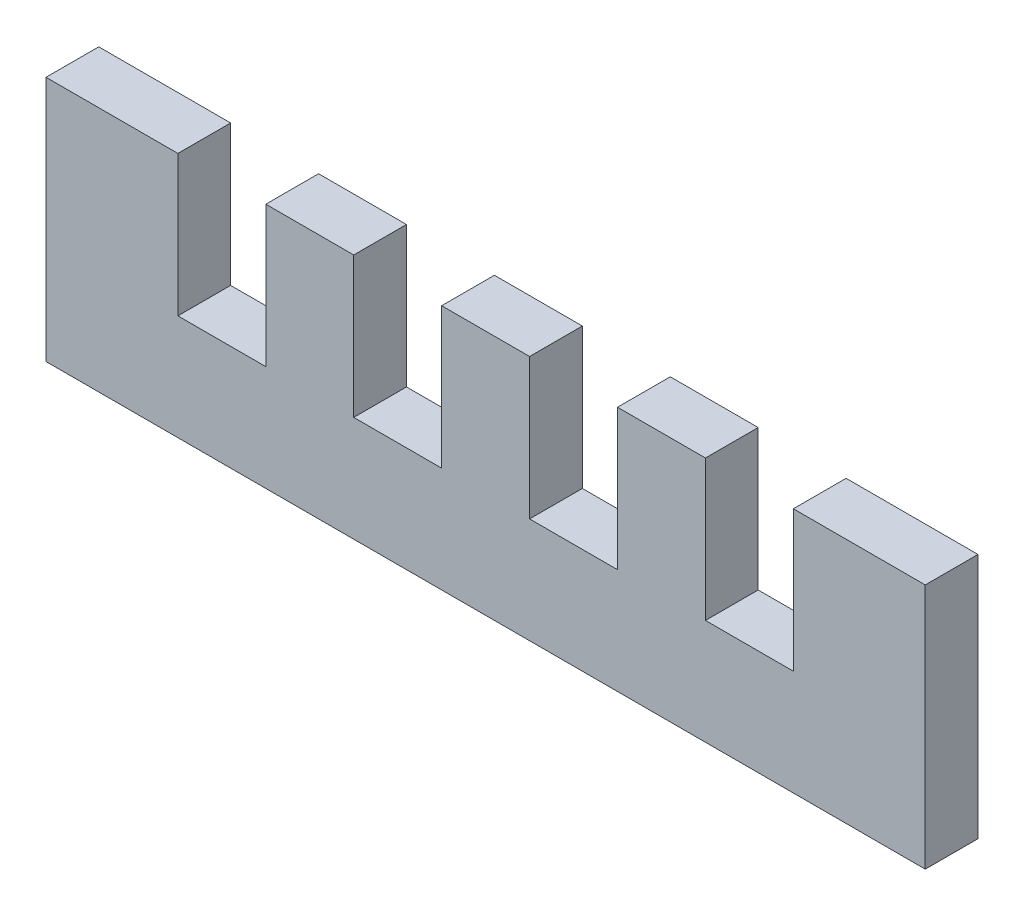
ISO-10303-21;
HEADER;
FILE_DESCRIPTION(('STEP AP214'),'2;1');
FILE_NAME('part.step','',(''),(''),'','','');
FILE_SCHEMA(('AUTOMOTIVE_DESIGN { 1 0 10303 214 1 1 1 1 }'));
ENDSEC;
DATA;
#1=APPLICATION_CONTEXT('core data for automotive mechanical design processes');
#2=APPLICATION_PROTOCOL_DEFINITION('international standard','automotive_design',2000,#1);
#3=PRODUCT_CONTEXT('',#1,'mechanical');
#4=PRODUCT('Part','Part','',(#3));
#5=PRODUCT_RELATED_PRODUCT_CATEGORY('part','',(#4));
#6=PRODUCT_DEFINITION_FORMATION('','',#4);
#7=PRODUCT_DEFINITION_CONTEXT('part definition',#1,'design');
#8=PRODUCT_DEFINITION('design','',#6,#7);
#9=PRODUCT_DEFINITION_SHAPE('','',#8);
#10=(LENGTH_UNIT() NAMED_UNIT(*) SI_UNIT(.MILLI.,.METRE.));
#11=(NAMED_UNIT(*) PLANE_ANGLE_UNIT() SI_UNIT($,.RADIAN.));
#12=(NAMED_UNIT(*) SI_UNIT($,.STERADIAN.) SOLID_ANGLE_UNIT());
#13=UNCERTAINTY_MEASURE_WITH_UNIT(LENGTH_MEASURE(1.E-05),#10,'distance_accuracy_value','');
#14=(GEOMETRIC_REPRESENTATION_CONTEXT(3) GLOBAL_UNCERTAINTY_ASSIGNED_CONTEXT((#13)) GLOBAL_UNIT_ASSIGNED_CONTEXT((#10,
#11,#12)) REPRESENTATION_CONTEXT('',''));
#15=CARTESIAN_POINT('',(0.,0.,0.));
#16=DIRECTION('',(0.,0.,1.));
#17=DIRECTION('',(1.,0.,0.));
#18=AXIS2_PLACEMENT_3D('',#15,#16,#17);
#19=CARTESIAN_POINT('',(0.,14.,3.));
#20=DIRECTION('',(0.,1.,0.));
#21=DIRECTION('',(0.,0.,1.));
#22=AXIS2_PLACEMENT_3D('',#19,#20,#21);
#23=PLANE('',#22);
#24=DIRECTION('',(1.,0.,0.));
#25=VECTOR('',#24,1.);
#26=CARTESIAN_POINT('',(0.,14.,0.));
#27=LINE('',#26,#25);
#28=CARTESIAN_POINT('',(17.5,14.,0.));
#29=VERTEX_POINT('',#28);
#30=CARTESIAN_POINT('',(25.,14.,0.));
#31=VERTEX_POINT('',#30);
#32=EDGE_CURVE('E207',#29,#31,#27,.T.);
#33=ORIENTED_EDGE('',*,*,#32,.F.);
#34=DIRECTION('',(0.,0.,-1.));
#35=VECTOR('',#34,1.);
#36=CARTESIAN_POINT('',(17.5,14.,3.));
#37=LINE('',#36,#35);
#38=CARTESIAN_POINT('',(17.5,14.,3.));
#39=VERTEX_POINT('',#38);
#40=EDGE_CURVE('E11',#39,#29,#37,.T.);
#41=ORIENTED_EDGE('',*,*,#40,.F.);
#42=DIRECTION('',(1.,0.,0.));
#43=VECTOR('',#42,1.);
#44=CARTESIAN_POINT('',(0.,14.,3.));
#45=LINE('',#44,#43);
#46=CARTESIAN_POINT('',(25.,14.,3.));
#47=VERTEX_POINT('',#46);
#48=EDGE_CURVE('E262',#39,#47,#45,.T.);
#49=ORIENTED_EDGE('',*,*,#48,.T.);
#50=DIRECTION('',(0.,0.,-1.));
#51=VECTOR('',#50,1.);
#52=CARTESIAN_POINT('',(25.,14.,3.));
#53=LINE('',#52,#51);
#54=EDGE_CURVE('E127',#47,#31,#53,.T.);
#55=ORIENTED_EDGE('',*,*,#54,.T.);
#56=EDGE_LOOP('',(#33,#41,#49,#55));
#57=FACE_BOUND('',#56,.T.);
#58=ADVANCED_FACE('F41',(#57),#23,.T.);
#59=CARTESIAN_POINT('',(17.5,0.,3.));
#60=DIRECTION('',(-1.,0.,0.));
#61=DIRECTION('',(0.,0.,1.));
#62=AXIS2_PLACEMENT_3D('',#59,#60,#61);
#63=PLANE('',#62);
#64=DIRECTION('',(0.,1.,0.));
#65=VECTOR('',#64,1.);
#66=CARTESIAN_POINT('',(17.5,0.,0.));
#67=LINE('',#66,#65);
#68=CARTESIAN_POINT('',(17.5,6.00000000000001,0.));
#69=VERTEX_POINT('',#68);
#70=EDGE_CURVE('E210',#69,#29,#67,.T.);
#71=ORIENTED_EDGE('',*,*,#70,.F.);
#72=DIRECTION('',(0.,0.,-1.));
#73=VECTOR('',#72,1.);
#74=CARTESIAN_POINT('',(17.5,6.00000000000001,3.));
#75=LINE('',#74,#73);
#76=CARTESIAN_POINT('',(17.5,6.00000000000001,3.));
#77=VERTEX_POINT('',#76);
#78=EDGE_CURVE('E49',#77,#69,#75,.T.);
#79=ORIENTED_EDGE('',*,*,#78,.F.);
#80=DIRECTION('',(0.,1.,0.));
#81=VECTOR('',#80,1.);
#82=CARTESIAN_POINT('',(17.5,0.,3.));
#83=LINE('',#82,#81);
#84=EDGE_CURVE('E315',#77,#39,#83,.T.);
#85=ORIENTED_EDGE('',*,*,#84,.T.);
#86=ORIENTED_EDGE('',*,*,#40,.T.);
#87=EDGE_LOOP('',(#71,#79,#85,#86));
#88=FACE_BOUND('',#87,.T.);
#89=ADVANCED_FACE('F303',(#88),#63,.T.);
#90=CARTESIAN_POINT('',(0.,6.00000000000001,3.));
#91=DIRECTION('',(0.,1.,0.));
#92=DIRECTION('',(0.,0.,1.));
#93=AXIS2_PLACEMENT_3D('',#90,#91,#92);
#94=PLANE('',#93);
#95=DIRECTION('',(1.,0.,0.));
#96=VECTOR('',#95,1.);
#97=CARTESIAN_POINT('',(0.,6.00000000000001,0.));
#98=LINE('',#97,#96);
#99=CARTESIAN_POINT('',(12.5,6.00000000000001,0.));
#100=VERTEX_POINT('',#99);
#101=EDGE_CURVE('E213',#100,#69,#98,.T.);
#102=ORIENTED_EDGE('',*,*,#101,.F.);
#103=DIRECTION('',(0.,0.,-1.));
#104=VECTOR('',#103,1.);
#105=CARTESIAN_POINT('',(12.5,6.00000000000001,3.));
#106=LINE('',#105,#104);
#107=CARTESIAN_POINT('',(12.5,6.00000000000001,3.));
#108=VERTEX_POINT('',#107);
#109=EDGE_CURVE('E292',#108,#100,#106,.T.);
#110=ORIENTED_EDGE('',*,*,#109,.F.);
#111=DIRECTION('',(1.,0.,0.));
#112=VECTOR('',#111,1.);
#113=CARTESIAN_POINT('',(0.,6.00000000000001,3.));
#114=LINE('',#113,#112);
#115=EDGE_CURVE('E299',#108,#77,#114,.T.);
#116=ORIENTED_EDGE('',*,*,#115,.T.);
#117=ORIENTED_EDGE('',*,*,#78,.T.);
#118=EDGE_LOOP('',(#102,#110,#116,#117));
#119=FACE_BOUND('',#118,.T.);
#120=ADVANCED_FACE('F297',(#119),#94,.T.);
#121=CARTESIAN_POINT('',(12.5,0.,3.));
#122=DIRECTION('',(1.,0.,0.));
#123=DIRECTION('',(0.,0.,-1.));
#124=AXIS2_PLACEMENT_3D('',#121,#122,#123);
#125=PLANE('',#124);
#126=DIRECTION('',(0.,-1.,0.));
#127=VECTOR('',#126,1.);
#128=CARTESIAN_POINT('',(12.5,0.,0.));
#129=LINE('',#128,#127);
#130=CARTESIAN_POINT('',(12.5,14.,0.));
#131=VERTEX_POINT('',#130);
#132=EDGE_CURVE('E216',#131,#100,#129,.T.);
#133=ORIENTED_EDGE('',*,*,#132,.F.);
#134=DIRECTION('',(0.,0.,-1.));
#135=VECTOR('',#134,1.);
#136=CARTESIAN_POINT('',(12.5,14.,3.));
#137=LINE('',#136,#135);
#138=CARTESIAN_POINT('',(12.5,14.,3.));
#139=VERTEX_POINT('',#138);
#140=EDGE_CURVE('E290',#139,#131,#137,.T.);
#141=ORIENTED_EDGE('',*,*,#140,.F.);
#142=DIRECTION('',(0.,-1.,0.));
#143=VECTOR('',#142,1.);
#144=CARTESIAN_POINT('',(12.5,0.,3.));
#145=LINE('',#144,#143);
#146=EDGE_CURVE('E312',#139,#108,#145,.T.);
#147=ORIENTED_EDGE('',*,*,#146,.T.);
#148=ORIENTED_EDGE('',*,*,#109,.T.);
#149=EDGE_LOOP('',(#133,#141,#147,#148));
#150=FACE_BOUND('',#149,.T.);
#151=ADVANCED_FACE('F309',(#150),#125,.T.);
#152=CARTESIAN_POINT('',(0.,14.,3.));
#153=DIRECTION('',(0.,1.,0.));
#154=DIRECTION('',(0.,0.,1.));
#155=AXIS2_PLACEMENT_3D('',#152,#153,#154);
#156=PLANE('',#155);
#157=DIRECTION('',(1.,0.,0.));
#158=VECTOR('',#157,1.);
#159=CARTESIAN_POINT('',(0.,14.,0.));
#160=LINE('',#159,#158);
#161=CARTESIAN_POINT('',(7.5,14.,0.));
#162=VERTEX_POINT('',#161);
#163=EDGE_CURVE('E219',#162,#131,#160,.T.);
#164=ORIENTED_EDGE('',*,*,#163,.F.);
#165=DIRECTION('',(0.,0.,-1.));
#166=VECTOR('',#165,1.);
#167=CARTESIAN_POINT('',(7.5,14.,3.));
#168=LINE('',#167,#166);
#169=CARTESIAN_POINT('',(7.5,14.,3.));
#170=VERTEX_POINT('',#169);
#171=EDGE_CURVE('E288',#170,#162,#168,.T.);
#172=ORIENTED_EDGE('',*,*,#171,.F.);
#173=DIRECTION('',(1.,0.,0.));
#174=VECTOR('',#173,1.);
#175=CARTESIAN_POINT('',(0.,14.,3.));
#176=LINE('',#175,#174);
#177=EDGE_CURVE('E317',#170,#139,#176,.T.);
#178=ORIENTED_EDGE('',*,*,#177,.T.);
#179=ORIENTED_EDGE('',*,*,#140,.T.);
#180=EDGE_LOOP('',(#164,#172,#178,#179));
#181=FACE_BOUND('',#180,.T.);
#182=ADVANCED_FACE('F376',(#181),#156,.T.);
#183=CARTESIAN_POINT('',(7.5,0.,3.));
#184=DIRECTION('',(-1.,0.,0.));
#185=DIRECTION('',(0.,0.,1.));
#186=AXIS2_PLACEMENT_3D('',#183,#184,#185);
#187=PLANE('',#186);
#188=DIRECTION('',(0.,1.,0.));
#189=VECTOR('',#188,1.);
#190=CARTESIAN_POINT('',(7.5,0.,0.));
#191=LINE('',#190,#189);
#192=CARTESIAN_POINT('',(7.5,6.00000000000001,0.));
#193=VERTEX_POINT('',#192);
#194=EDGE_CURVE('E222',#193,#162,#191,.T.);
#195=ORIENTED_EDGE('',*,*,#194,.F.);
#196=DIRECTION('',(0.,0.,-1.));
#197=VECTOR('',#196,1.);
#198=CARTESIAN_POINT('',(7.5,6.00000000000001,3.));
#199=LINE('',#198,#197);
#200=CARTESIAN_POINT('',(7.5,6.00000000000001,3.));
#201=VERTEX_POINT('',#200);
#202=EDGE_CURVE('E286',#201,#193,#199,.T.);
#203=ORIENTED_EDGE('',*,*,#202,.F.);
#204=DIRECTION('',(0.,1.,0.));
#205=VECTOR('',#204,1.);
#206=CARTESIAN_POINT('',(7.5,0.,3.));
#207=LINE('',#206,#205);
#208=EDGE_CURVE('E323',#201,#170,#207,.T.);
#209=ORIENTED_EDGE('',*,*,#208,.T.);
#210=ORIENTED_EDGE('',*,*,#171,.T.);
#211=EDGE_LOOP('',(#195,#203,#209,#210));
#212=FACE_BOUND('',#211,.T.);
#213=ADVANCED_FACE('F379',(#212),#187,.T.);
#214=CARTESIAN_POINT('',(0.,6.00000000000001,3.));
#215=DIRECTION('',(0.,1.,0.));
#216=DIRECTION('',(0.,0.,1.));
#217=AXIS2_PLACEMENT_3D('',#214,#215,#216);
#218=PLANE('',#217);
#219=DIRECTION('',(1.,0.,0.));
#220=VECTOR('',#219,1.);
#221=CARTESIAN_POINT('',(0.,6.00000000000001,0.));
#222=LINE('',#221,#220);
#223=CARTESIAN_POINT('',(2.5,6.00000000000001,0.));
#224=VERTEX_POINT('',#223);
#225=EDGE_CURVE('E225',#224,#193,#222,.T.);
#226=ORIENTED_EDGE('',*,*,#225,.F.);
#227=DIRECTION('',(0.,0.,-1.));
#228=VECTOR('',#227,1.);
#229=CARTESIAN_POINT('',(2.5,6.00000000000001,3.));
#230=LINE('',#229,#228);
#231=CARTESIAN_POINT('',(2.5,6.00000000000001,3.));
#232=VERTEX_POINT('',#231);
#233=EDGE_CURVE('E284',#232,#224,#230,.T.);
#234=ORIENTED_EDGE('',*,*,#233,.F.);
#235=DIRECTION('',(1.,0.,0.));
#236=VECTOR('',#235,1.);
#237=CARTESIAN_POINT('',(0.,6.00000000000001,3.));
#238=LINE('',#237,#236);
#239=EDGE_CURVE('E326',#232,#201,#238,.T.);
#240=ORIENTED_EDGE('',*,*,#239,.T.);
#241=ORIENTED_EDGE('',*,*,#202,.T.);
#242=EDGE_LOOP('',(#226,#234,#240,#241));
#243=FACE_BOUND('',#242,.T.);
#244=ADVANCED_FACE('F383',(#243),#218,.T.);
#245=CARTESIAN_POINT('',(2.5,0.,3.));
#246=DIRECTION('',(1.,0.,0.));
#247=DIRECTION('',(0.,0.,-1.));
#248=AXIS2_PLACEMENT_3D('',#245,#246,#247);
#249=PLANE('',#248);
#250=DIRECTION('',(0.,-1.,0.));
#251=VECTOR('',#250,1.);
#252=CARTESIAN_POINT('',(2.5,0.,0.));
#253=LINE('',#252,#251);
#254=CARTESIAN_POINT('',(2.5,14.,0.));
#255=VERTEX_POINT('',#254);
#256=EDGE_CURVE('E228',#255,#224,#253,.T.);
#257=ORIENTED_EDGE('',*,*,#256,.F.);
#258=DIRECTION('',(0.,0.,-1.));
#259=VECTOR('',#258,1.);
#260=CARTESIAN_POINT('',(2.5,14.,3.));
#261=LINE('',#260,#259);
#262=CARTESIAN_POINT('',(2.5,14.,3.));
#263=VERTEX_POINT('',#262);
#264=EDGE_CURVE('E282',#263,#255,#261,.T.);
#265=ORIENTED_EDGE('',*,*,#264,.F.);
#266=DIRECTION('',(0.,-1.,0.));
#267=VECTOR('',#266,1.);
#268=CARTESIAN_POINT('',(2.5,0.,3.));
#269=LINE('',#268,#267);
#270=EDGE_CURVE('E329',#263,#232,#269,.T.);
#271=ORIENTED_EDGE('',*,*,#270,.T.);
#272=ORIENTED_EDGE('',*,*,#233,.T.);
#273=EDGE_LOOP('',(#257,#265,#271,#272));
#274=FACE_BOUND('',#273,.T.);
#275=ADVANCED_FACE('F387',(#274),#249,.T.);
#276=CARTESIAN_POINT('',(0.,14.,3.));
#277=DIRECTION('',(0.,1.,0.));
#278=DIRECTION('',(-1.,0.,0.));
#279=AXIS2_PLACEMENT_3D('',#276,#277,#278);
#280=PLANE('',#279);
#281=DIRECTION('',(1.,0.,0.));
#282=VECTOR('',#281,1.);
#283=CARTESIAN_POINT('',(0.,14.,0.));
#284=LINE('',#283,#282);
#285=CARTESIAN_POINT('',(-2.5,14.,0.));
#286=VERTEX_POINT('',#285);
#287=EDGE_CURVE('E231',#286,#255,#284,.T.);
#288=ORIENTED_EDGE('',*,*,#287,.F.);
#289=DIRECTION('',(0.,0.,-1.));
#290=VECTOR('',#289,1.);
#291=CARTESIAN_POINT('',(-2.5,14.,3.));
#292=LINE('',#291,#290);
#293=CARTESIAN_POINT('',(-2.5,14.,3.));
#294=VERTEX_POINT('',#293);
#295=EDGE_CURVE('E280',#294,#286,#292,.T.);
#296=ORIENTED_EDGE('',*,*,#295,.F.);
#297=DIRECTION('',(1.,0.,0.));
#298=VECTOR('',#297,1.);
#299=CARTESIAN_POINT('',(0.,14.,3.));
#300=LINE('',#299,#298);
#301=EDGE_CURVE('E332',#294,#263,#300,.T.);
#302=ORIENTED_EDGE('',*,*,#301,.T.);
#303=ORIENTED_EDGE('',*,*,#264,.T.);
#304=EDGE_LOOP('',(#288,#296,#302,#303));
#305=FACE_BOUND('',#304,.T.);
#306=ADVANCED_FACE('F391',(#305),#280,.T.);
#307=CARTESIAN_POINT('',(-2.5,0.,3.));
#308=DIRECTION('',(-1.,0.,0.));
#309=DIRECTION('',(0.,0.,1.));
#310=AXIS2_PLACEMENT_3D('',#307,#308,#309);
#311=PLANE('',#310);
#312=DIRECTION('',(0.,1.,0.));
#313=VECTOR('',#312,1.);
#314=CARTESIAN_POINT('',(-2.5,0.,0.));
#315=LINE('',#314,#313);
#316=CARTESIAN_POINT('',(-2.5,6.00000000000001,0.));
#317=VERTEX_POINT('',#316);
#318=EDGE_CURVE('E234',#317,#286,#315,.T.);
#319=ORIENTED_EDGE('',*,*,#318,.F.);
#320=DIRECTION('',(0.,0.,-1.));
#321=VECTOR('',#320,1.);
#322=CARTESIAN_POINT('',(-2.5,6.00000000000001,3.));
#323=LINE('',#322,#321);
#324=CARTESIAN_POINT('',(-2.5,6.00000000000001,3.));
#325=VERTEX_POINT('',#324);
#326=EDGE_CURVE('E278',#325,#317,#323,.T.);
#327=ORIENTED_EDGE('',*,*,#326,.F.);
#328=DIRECTION('',(0.,1.,0.));
#329=VECTOR('',#328,1.);
#330=CARTESIAN_POINT('',(-2.5,0.,3.));
#331=LINE('',#330,#329);
#332=EDGE_CURVE('E335',#325,#294,#331,.T.);
#333=ORIENTED_EDGE('',*,*,#332,.T.);
#334=ORIENTED_EDGE('',*,*,#295,.T.);
#335=EDGE_LOOP('',(#319,#327,#333,#334));
#336=FACE_BOUND('',#335,.T.);
#337=ADVANCED_FACE('F395',(#336),#311,.T.);
#338=CARTESIAN_POINT('',(0.,6.00000000000001,3.));
#339=DIRECTION('',(0.,1.,0.));
#340=DIRECTION('',(0.,0.,1.));
#341=AXIS2_PLACEMENT_3D('',#338,#339,#340);
#342=PLANE('',#341);
#343=DIRECTION('',(1.,0.,0.));
#344=VECTOR('',#343,1.);
#345=CARTESIAN_POINT('',(0.,6.00000000000001,0.));
#346=LINE('',#345,#344);
#347=CARTESIAN_POINT('',(-7.5,6.00000000000001,0.));
#348=VERTEX_POINT('',#347);
#349=EDGE_CURVE('E237',#348,#317,#346,.T.);
#350=ORIENTED_EDGE('',*,*,#349,.F.);
#351=DIRECTION('',(0.,0.,-1.));
#352=VECTOR('',#351,1.);
#353=CARTESIAN_POINT('',(-7.5,6.00000000000001,3.));
#354=LINE('',#353,#352);
#355=CARTESIAN_POINT('',(-7.5,6.00000000000001,3.));
#356=VERTEX_POINT('',#355);
#357=EDGE_CURVE('E276',#356,#348,#354,.T.);
#358=ORIENTED_EDGE('',*,*,#357,.F.);
#359=DIRECTION('',(1.,0.,0.));
#360=VECTOR('',#359,1.);
#361=CARTESIAN_POINT('',(0.,6.00000000000001,3.));
#362=LINE('',#361,#360);
#363=EDGE_CURVE('E338',#356,#325,#362,.T.);
#364=ORIENTED_EDGE('',*,*,#363,.T.);
#365=ORIENTED_EDGE('',*,*,#326,.T.);
#366=EDGE_LOOP('',(#350,#358,#364,#365));
#367=FACE_BOUND('',#366,.T.);
#368=ADVANCED_FACE('F399',(#367),#342,.T.);
#369=CARTESIAN_POINT('',(-7.5,0.,3.));
#370=DIRECTION('',(1.,0.,0.));
#371=DIRECTION('',(0.,0.,-1.));
#372=AXIS2_PLACEMENT_3D('',#369,#370,#371);
#373=PLANE('',#372);
#374=DIRECTION('',(0.,-1.,0.));
#375=VECTOR('',#374,1.);
#376=CARTESIAN_POINT('',(-7.5,0.,0.));
#377=LINE('',#376,#375);
#378=CARTESIAN_POINT('',(-7.5,14.,0.));
#379=VERTEX_POINT('',#378);
#380=EDGE_CURVE('E240',#379,#348,#377,.T.);
#381=ORIENTED_EDGE('',*,*,#380,.F.);
#382=DIRECTION('',(0.,0.,-1.));
#383=VECTOR('',#382,1.);
#384=CARTESIAN_POINT('',(-7.5,14.,3.));
#385=LINE('',#384,#383);
#386=CARTESIAN_POINT('',(-7.5,14.,3.));
#387=VERTEX_POINT('',#386);
#388=EDGE_CURVE('E274',#387,#379,#385,.T.);
#389=ORIENTED_EDGE('',*,*,#388,.F.);
#390=DIRECTION('',(0.,-1.,0.));
#391=VECTOR('',#390,1.);
#392=CARTESIAN_POINT('',(-7.5,0.,3.));
#393=LINE('',#392,#391);
#394=EDGE_CURVE('E341',#387,#356,#393,.T.);
#395=ORIENTED_EDGE('',*,*,#394,.T.);
#396=ORIENTED_EDGE('',*,*,#357,.T.);
#397=EDGE_LOOP('',(#381,#389,#395,#396));
#398=FACE_BOUND('',#397,.T.);
#399=ADVANCED_FACE('F403',(#398),#373,.T.);
#400=CARTESIAN_POINT('',(0.,14.,3.));
#401=DIRECTION('',(0.,1.,0.));
#402=DIRECTION('',(0.,0.,1.));
#403=AXIS2_PLACEMENT_3D('',#400,#401,#402);
#404=PLANE('',#403);
#405=DIRECTION('',(1.,0.,0.));
#406=VECTOR('',#405,1.);
#407=CARTESIAN_POINT('',(0.,14.,0.));
#408=LINE('',#407,#406);
#409=CARTESIAN_POINT('',(-12.5,14.,0.));
#410=VERTEX_POINT('',#409);
#411=EDGE_CURVE('E243',#410,#379,#408,.T.);
#412=ORIENTED_EDGE('',*,*,#411,.F.);
#413=DIRECTION('',(0.,0.,-1.));
#414=VECTOR('',#413,1.);
#415=CARTESIAN_POINT('',(-12.5,14.,3.));
#416=LINE('',#415,#414);
#417=CARTESIAN_POINT('',(-12.5,14.,3.));
#418=VERTEX_POINT('',#417);
#419=EDGE_CURVE('E272',#418,#410,#416,.T.);
#420=ORIENTED_EDGE('',*,*,#419,.F.);
#421=DIRECTION('',(1.,0.,0.));
#422=VECTOR('',#421,1.);
#423=CARTESIAN_POINT('',(0.,14.,3.));
#424=LINE('',#423,#422);
#425=EDGE_CURVE('E344',#418,#387,#424,.T.);
#426=ORIENTED_EDGE('',*,*,#425,.T.);
#427=ORIENTED_EDGE('',*,*,#388,.T.);
#428=EDGE_LOOP('',(#412,#420,#426,#427));
#429=FACE_BOUND('',#428,.T.);
#430=ADVANCED_FACE('F407',(#429),#404,.T.);
#431=CARTESIAN_POINT('',(-12.5,0.,3.));
#432=DIRECTION('',(-1.,0.,0.));
#433=DIRECTION('',(0.,0.,1.));
#434=AXIS2_PLACEMENT_3D('',#431,#432,#433);
#435=PLANE('',#434);
#436=DIRECTION('',(0.,1.,0.));
#437=VECTOR('',#436,1.);
#438=CARTESIAN_POINT('',(-12.5,0.,0.));
#439=LINE('',#438,#437);
#440=CARTESIAN_POINT('',(-12.5,6.00000000000001,0.));
#441=VERTEX_POINT('',#440);
#442=EDGE_CURVE('E246',#441,#410,#439,.T.);
#443=ORIENTED_EDGE('',*,*,#442,.F.);
#444=DIRECTION('',(0.,0.,-1.));
#445=VECTOR('',#444,1.);
#446=CARTESIAN_POINT('',(-12.5,6.00000000000001,3.));
#447=LINE('',#446,#445);
#448=CARTESIAN_POINT('',(-12.5,6.00000000000001,3.));
#449=VERTEX_POINT('',#448);
#450=EDGE_CURVE('E270',#449,#441,#447,.T.);
#451=ORIENTED_EDGE('',*,*,#450,.F.);
#452=DIRECTION('',(0.,1.,0.));
#453=VECTOR('',#452,1.);
#454=CARTESIAN_POINT('',(-12.5,0.,3.));
#455=LINE('',#454,#453);
#456=EDGE_CURVE('E347',#449,#418,#455,.T.);
#457=ORIENTED_EDGE('',*,*,#456,.T.);
#458=ORIENTED_EDGE('',*,*,#419,.T.);
#459=EDGE_LOOP('',(#443,#451,#457,#458));
#460=FACE_BOUND('',#459,.T.);
#461=ADVANCED_FACE('F411',(#460),#435,.T.);
#462=CARTESIAN_POINT('',(0.,6.00000000000001,3.));
#463=DIRECTION('',(0.,1.,0.));
#464=DIRECTION('',(0.,0.,1.));
#465=AXIS2_PLACEMENT_3D('',#462,#463,#464);
#466=PLANE('',#465);
#467=DIRECTION('',(1.,0.,0.));
#468=VECTOR('',#467,1.);
#469=CARTESIAN_POINT('',(0.,6.00000000000001,0.));
#470=LINE('',#469,#468);
#471=CARTESIAN_POINT('',(-17.5,6.00000000000001,0.));
#472=VERTEX_POINT('',#471);
#473=EDGE_CURVE('E249',#472,#441,#470,.T.);
#474=ORIENTED_EDGE('',*,*,#473,.F.);
#475=DIRECTION('',(0.,0.,-1.));
#476=VECTOR('',#475,1.);
#477=CARTESIAN_POINT('',(-17.5,6.00000000000001,3.));
#478=LINE('',#477,#476);
#479=CARTESIAN_POINT('',(-17.5,6.00000000000001,3.));
#480=VERTEX_POINT('',#479);
#481=EDGE_CURVE('E268',#480,#472,#478,.T.);
#482=ORIENTED_EDGE('',*,*,#481,.F.);
#483=DIRECTION('',(1.,0.,0.));
#484=VECTOR('',#483,1.);
#485=CARTESIAN_POINT('',(0.,6.00000000000001,3.));
#486=LINE('',#485,#484);
#487=EDGE_CURVE('E350',#480,#449,#486,.T.);
#488=ORIENTED_EDGE('',*,*,#487,.T.);
#489=ORIENTED_EDGE('',*,*,#450,.T.);
#490=EDGE_LOOP('',(#474,#482,#488,#489));
#491=FACE_BOUND('',#490,.T.);
#492=ADVANCED_FACE('F415',(#491),#466,.T.);
#493=CARTESIAN_POINT('',(-17.5,0.,3.));
#494=DIRECTION('',(1.,0.,0.));
#495=DIRECTION('',(0.,0.,-1.));
#496=AXIS2_PLACEMENT_3D('',#493,#494,#495);
#497=PLANE('',#496);
#498=DIRECTION('',(0.,-1.,0.));
#499=VECTOR('',#498,1.);
#500=CARTESIAN_POINT('',(-17.5,0.,0.));
#501=LINE('',#500,#499);
#502=CARTESIAN_POINT('',(-17.5,14.,0.));
#503=VERTEX_POINT('',#502);
#504=EDGE_CURVE('E252',#503,#472,#501,.T.);
#505=ORIENTED_EDGE('',*,*,#504,.F.);
#506=DIRECTION('',(0.,0.,-1.));
#507=VECTOR('',#506,1.);
#508=CARTESIAN_POINT('',(-17.5,14.,3.));
#509=LINE('',#508,#507);
#510=CARTESIAN_POINT('',(-17.5,14.,3.));
#511=VERTEX_POINT('',#510);
#512=EDGE_CURVE('E266',#511,#503,#509,.T.);
#513=ORIENTED_EDGE('',*,*,#512,.F.);
#514=DIRECTION('',(0.,-1.,0.));
#515=VECTOR('',#514,1.);
#516=CARTESIAN_POINT('',(-17.5,0.,3.));
#517=LINE('',#516,#515);
#518=EDGE_CURVE('E202',#511,#480,#517,.T.);
#519=ORIENTED_EDGE('',*,*,#518,.T.);
#520=ORIENTED_EDGE('',*,*,#481,.T.);
#521=EDGE_LOOP('',(#505,#513,#519,#520));
#522=FACE_BOUND('',#521,.T.);
#523=ADVANCED_FACE('F355',(#522),#497,.T.);
#524=CARTESIAN_POINT('',(0.,14.,3.));
#525=DIRECTION('',(0.,1.,0.));
#526=DIRECTION('',(-1.,0.,0.));
#527=AXIS2_PLACEMENT_3D('',#524,#525,#526);
#528=PLANE('',#527);
#529=DIRECTION('',(1.,0.,0.));
#530=VECTOR('',#529,1.);
#531=CARTESIAN_POINT('',(0.,14.,0.));
#532=LINE('',#531,#530);
#533=CARTESIAN_POINT('',(-25.,14.,0.));
#534=VERTEX_POINT('',#533);
#535=EDGE_CURVE('E255',#534,#503,#532,.T.);
#536=ORIENTED_EDGE('',*,*,#535,.F.);
#537=DIRECTION('',(0.,0.,-1.));
#538=VECTOR('',#537,1.);
#539=CARTESIAN_POINT('',(-25.,14.,3.));
#540=LINE('',#539,#538);
#541=CARTESIAN_POINT('',(-25.,14.,3.));
#542=VERTEX_POINT('',#541);
#543=EDGE_CURVE('E190',#542,#534,#540,.T.);
#544=ORIENTED_EDGE('',*,*,#543,.F.);
#545=DIRECTION('',(1.,0.,0.));
#546=VECTOR('',#545,1.);
#547=CARTESIAN_POINT('',(0.,14.,3.));
#548=LINE('',#547,#546);
#549=EDGE_CURVE('E200',#542,#511,#548,.T.);
#550=ORIENTED_EDGE('',*,*,#549,.T.);
#551=ORIENTED_EDGE('',*,*,#512,.T.);
#552=EDGE_LOOP('',(#536,#544,#550,#551));
#553=FACE_BOUND('',#552,.T.);
#554=ADVANCED_FACE('F361',(#553),#528,.T.);
#555=CARTESIAN_POINT('',(-25.,0.,3.));
#556=DIRECTION('',(-1.,0.,0.));
#557=DIRECTION('',(0.,0.,1.));
#558=AXIS2_PLACEMENT_3D('',#555,#556,#557);
#559=PLANE('',#558);
#560=DIRECTION('',(0.,1.,0.));
#561=VECTOR('',#560,1.);
#562=CARTESIAN_POINT('',(-25.,0.,0.));
#563=LINE('',#562,#561);
#564=CARTESIAN_POINT('',(-25.,0.,0.));
#565=VERTEX_POINT('',#564);
#566=EDGE_CURVE('E189',#565,#534,#563,.T.);
#567=ORIENTED_EDGE('',*,*,#566,.F.);
#568=DIRECTION('',(0.,0.,-1.));
#569=VECTOR('',#568,1.);
#570=CARTESIAN_POINT('',(-25.,0.,3.));
#571=LINE('',#570,#569);
#572=CARTESIAN_POINT('',(-25.,0.,3.));
#573=VERTEX_POINT('',#572);
#574=EDGE_CURVE('E183',#573,#565,#571,.T.);
#575=ORIENTED_EDGE('',*,*,#574,.F.);
#576=DIRECTION('',(0.,1.,0.));
#577=VECTOR('',#576,1.);
#578=CARTESIAN_POINT('',(-25.,0.,3.));
#579=LINE('',#578,#577);
#580=EDGE_CURVE('E187',#573,#542,#579,.T.);
#581=ORIENTED_EDGE('',*,*,#580,.T.);
#582=ORIENTED_EDGE('',*,*,#543,.T.);
#583=EDGE_LOOP('',(#567,#575,#581,#582));
#584=FACE_BOUND('',#583,.T.);
#585=ADVANCED_FACE('F185',(#584),#559,.T.);
#586=CARTESIAN_POINT('',(0.,0.,3.));
#587=DIRECTION('',(0.,1.,0.));
#588=DIRECTION('',(0.,0.,1.));
#589=AXIS2_PLACEMENT_3D('',#586,#587,#588);
#590=PLANE('',#589);
#591=DIRECTION('',(1.,0.,0.));
#592=VECTOR('',#591,1.);
#593=CARTESIAN_POINT('',(0.,0.,0.));
#594=LINE('',#593,#592);
#595=CARTESIAN_POINT('',(25.,0.,0.));
#596=VERTEX_POINT('',#595);
#597=EDGE_CURVE('E120',#565,#596,#594,.T.);
#598=ORIENTED_EDGE('',*,*,#597,.T.);
#599=DIRECTION('',(0.,0.,-1.));
#600=VECTOR('',#599,1.);
#601=CARTESIAN_POINT('',(25.,0.,3.));
#602=LINE('',#601,#600);
#603=CARTESIAN_POINT('',(25.,0.,3.));
#604=VERTEX_POINT('',#603);
#605=EDGE_CURVE('E191',#604,#596,#602,.T.);
#606=ORIENTED_EDGE('',*,*,#605,.F.);
#607=DIRECTION('',(1.,0.,0.));
#608=VECTOR('',#607,1.);
#609=CARTESIAN_POINT('',(0.,0.,3.));
#610=LINE('',#609,#608);
#611=EDGE_CURVE('E193',#573,#604,#610,.T.);
#612=ORIENTED_EDGE('',*,*,#611,.F.);
#613=ORIENTED_EDGE('',*,*,#574,.T.);
#614=EDGE_LOOP('',(#598,#606,#612,#613));
#615=FACE_BOUND('',#614,.T.);
#616=ADVANCED_FACE('F194',(#615),#590,.F.);
#617=CARTESIAN_POINT('',(25.,0.,3.));
#618=DIRECTION('',(-1.,0.,0.));
#619=DIRECTION('',(0.,0.,1.));
#620=AXIS2_PLACEMENT_3D('',#617,#618,#619);
#621=PLANE('',#620);
#622=DIRECTION('',(0.,1.,0.));
#623=VECTOR('',#622,1.);
#624=CARTESIAN_POINT('',(25.,0.,0.));
#625=LINE('',#624,#623);
#626=EDGE_CURVE('E260',#596,#31,#625,.T.);
#627=ORIENTED_EDGE('',*,*,#626,.T.);
#628=ORIENTED_EDGE('',*,*,#54,.F.);
#629=DIRECTION('',(0.,1.,0.));
#630=VECTOR('',#629,1.);
#631=CARTESIAN_POINT('',(25.,0.,3.));
#632=LINE('',#631,#630);
#633=EDGE_CURVE('E57',#604,#47,#632,.T.);
#634=ORIENTED_EDGE('',*,*,#633,.F.);
#635=ORIENTED_EDGE('',*,*,#605,.T.);
#636=EDGE_LOOP('',(#627,#628,#634,#635));
#637=FACE_BOUND('',#636,.T.);
#638=ADVANCED_FACE('F364',(#637),#621,.F.);
#639=CARTESIAN_POINT('',(0.,0.,3.));
#640=DIRECTION('',(0.,0.,1.));
#641=DIRECTION('',(1.,0.,0.));
#642=AXIS2_PLACEMENT_3D('',#639,#640,#641);
#643=PLANE('',#642);
#644=ORIENTED_EDGE('',*,*,#48,.F.);
#645=ORIENTED_EDGE('',*,*,#84,.F.);
#646=ORIENTED_EDGE('',*,*,#115,.F.);
#647=ORIENTED_EDGE('',*,*,#146,.F.);
#648=ORIENTED_EDGE('',*,*,#177,.F.);
#649=ORIENTED_EDGE('',*,*,#208,.F.);
#650=ORIENTED_EDGE('',*,*,#239,.F.);
#651=ORIENTED_EDGE('',*,*,#270,.F.);
#652=ORIENTED_EDGE('',*,*,#301,.F.);
#653=ORIENTED_EDGE('',*,*,#332,.F.);
#654=ORIENTED_EDGE('',*,*,#363,.F.);
#655=ORIENTED_EDGE('',*,*,#394,.F.);
#656=ORIENTED_EDGE('',*,*,#425,.F.);
#657=ORIENTED_EDGE('',*,*,#456,.F.);
#658=ORIENTED_EDGE('',*,*,#487,.F.);
#659=ORIENTED_EDGE('',*,*,#518,.F.);
#660=ORIENTED_EDGE('',*,*,#549,.F.);
#661=ORIENTED_EDGE('',*,*,#580,.F.);
#662=ORIENTED_EDGE('',*,*,#611,.T.);
#663=ORIENTED_EDGE('',*,*,#633,.T.);
#664=EDGE_LOOP('',(#644,#645,#646,#647,#648,#649,#650,#651,#652,#653,#654,#655,#656,#657,#658,
#659,#660,#661,#662,#663));
#665=FACE_BOUND('',#664,.T.);
#666=ADVANCED_FACE('F197',(#665),#643,.T.);
#667=CARTESIAN_POINT('',(0.,0.,0.));
#668=DIRECTION('',(0.,0.,1.));
#669=DIRECTION('',(1.,0.,0.));
#670=AXIS2_PLACEMENT_3D('',#667,#668,#669);
#671=PLANE('',#670);
#672=ORIENTED_EDGE('',*,*,#32,.T.);
#673=ORIENTED_EDGE('',*,*,#626,.F.);
#674=ORIENTED_EDGE('',*,*,#597,.F.);
#675=ORIENTED_EDGE('',*,*,#566,.T.);
#676=ORIENTED_EDGE('',*,*,#535,.T.);
#677=ORIENTED_EDGE('',*,*,#504,.T.);
#678=ORIENTED_EDGE('',*,*,#473,.T.);
#679=ORIENTED_EDGE('',*,*,#442,.T.);
#680=ORIENTED_EDGE('',*,*,#411,.T.);
#681=ORIENTED_EDGE('',*,*,#380,.T.);
#682=ORIENTED_EDGE('',*,*,#349,.T.);
#683=ORIENTED_EDGE('',*,*,#318,.T.);
#684=ORIENTED_EDGE('',*,*,#287,.T.);
#685=ORIENTED_EDGE('',*,*,#256,.T.);
#686=ORIENTED_EDGE('',*,*,#225,.T.);
#687=ORIENTED_EDGE('',*,*,#194,.T.);
#688=ORIENTED_EDGE('',*,*,#163,.T.);
#689=ORIENTED_EDGE('',*,*,#132,.T.);
#690=ORIENTED_EDGE('',*,*,#101,.T.);
#691=ORIENTED_EDGE('',*,*,#70,.T.);
#692=EDGE_LOOP('',(#672,#673,#674,#675,#676,#677,#678,#679,#680,#681,#682,#683,#684,#685,#686,
#687,#688,#689,#690,#691));
#693=FACE_BOUND('',#692,.T.);
#694=ADVANCED_FACE('F305',(#693),#671,.F.);
#695=CLOSED_SHELL('',(#58,#89,#120,#151,#182,#213,#244,#275,#306,#337,#368,#399,#430,#461,#492,
#523,#554,#585,#616,#638,#666,#694));
#696=MANIFOLD_SOLID_BREP('B2',#695);
#697=ADVANCED_BREP_SHAPE_REPRESENTATION('',(#18,#696),#14);
#698=SHAPE_DEFINITION_REPRESENTATION(#9,#697);
ENDSEC;
END-ISO-10303-21;
